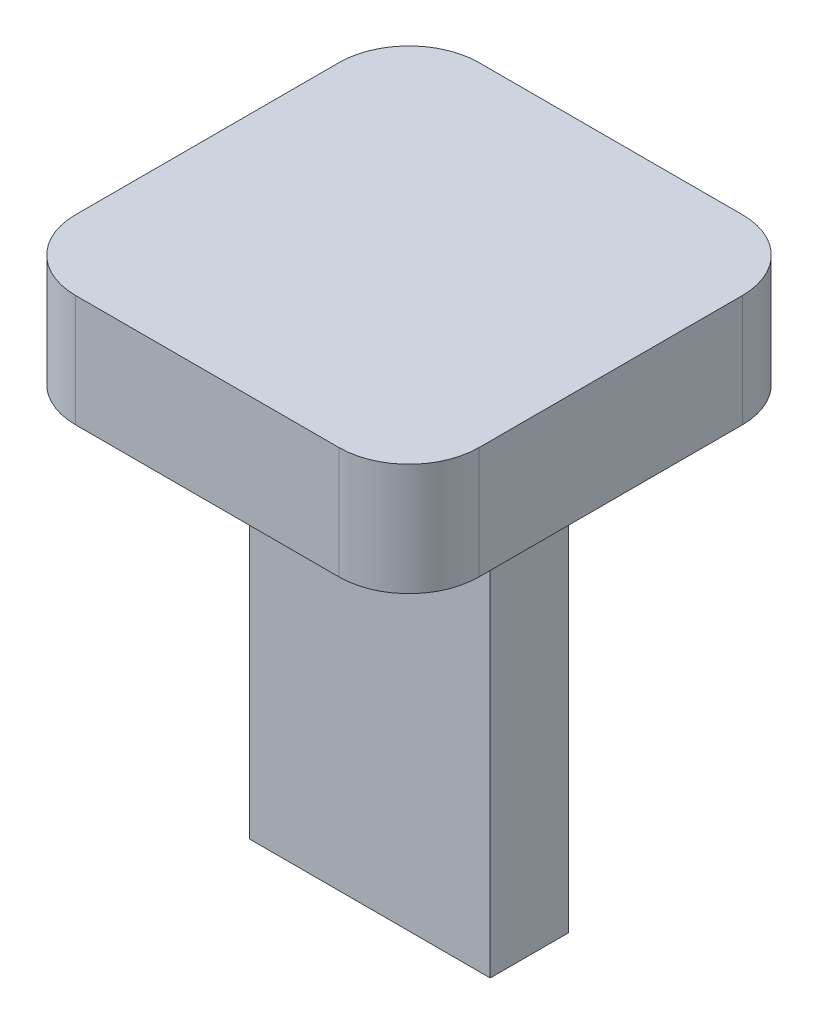
ISO-10303-21;
HEADER;
FILE_DESCRIPTION(('STEP AP214'),'2;1');
FILE_NAME('part.step','',(''),(''),'','','');
FILE_SCHEMA(('AUTOMOTIVE_DESIGN { 1 0 10303 214 1 1 1 1 }'));
ENDSEC;
DATA;
#1=APPLICATION_CONTEXT('core data for automotive mechanical design processes');
#2=APPLICATION_PROTOCOL_DEFINITION('international standard','automotive_design',2000,#1);
#3=PRODUCT_CONTEXT('',#1,'mechanical');
#4=PRODUCT('Part','Part','',(#3));
#5=PRODUCT_RELATED_PRODUCT_CATEGORY('part','',(#4));
#6=PRODUCT_DEFINITION_FORMATION('','',#4);
#7=PRODUCT_DEFINITION_CONTEXT('part definition',#1,'design');
#8=PRODUCT_DEFINITION('design','',#6,#7);
#9=PRODUCT_DEFINITION_SHAPE('','',#8);
#10=(LENGTH_UNIT() NAMED_UNIT(*) SI_UNIT(.MILLI.,.METRE.));
#11=(NAMED_UNIT(*) PLANE_ANGLE_UNIT() SI_UNIT($,.RADIAN.));
#12=(NAMED_UNIT(*) SI_UNIT($,.STERADIAN.) SOLID_ANGLE_UNIT());
#13=UNCERTAINTY_MEASURE_WITH_UNIT(LENGTH_MEASURE(1.E-05),#10,'distance_accuracy_value','');
#14=(GEOMETRIC_REPRESENTATION_CONTEXT(3) GLOBAL_UNCERTAINTY_ASSIGNED_CONTEXT((#13)) GLOBAL_UNIT_ASSIGNED_CONTEXT((#10,
#11,#12)) REPRESENTATION_CONTEXT('',''));
#15=CARTESIAN_POINT('',(0.,0.,0.));
#16=DIRECTION('',(0.,0.,1.));
#17=DIRECTION('',(1.,0.,0.));
#18=AXIS2_PLACEMENT_3D('',#15,#16,#17);
#19=CARTESIAN_POINT('',(2.15,7.75,-0.699999997));
#20=DIRECTION('',(-1.,0.,0.));
#21=DIRECTION('',(0.,0.,1.));
#22=AXIS2_PLACEMENT_3D('',#19,#20,#21);
#23=PLANE('',#22);
#24=DIRECTION('',(0.,-1.,0.));
#25=VECTOR('',#24,1.);
#26=CARTESIAN_POINT('',(2.15,7.75,-0.699999997));
#27=LINE('',#26,#25);
#28=CARTESIAN_POINT('',(2.15,6.5,-0.699999997));
#29=VERTEX_POINT('',#28);
#30=CARTESIAN_POINT('',(2.15,0.,-0.699999997));
#31=VERTEX_POINT('',#30);
#32=EDGE_CURVE('E150',#29,#31,#27,.T.);
#33=ORIENTED_EDGE('',*,*,#32,.F.);
#34=DIRECTION('',(0.,0.,-1.));
#35=VECTOR('',#34,1.);
#36=CARTESIAN_POINT('',(2.15,6.5,0.699999997));
#37=LINE('',#36,#35);
#38=CARTESIAN_POINT('',(2.15,6.5,0.699999997));
#39=VERTEX_POINT('',#38);
#40=EDGE_CURVE('E224',#29,#39,#37,.F.);
#41=ORIENTED_EDGE('',*,*,#40,.T.);
#42=DIRECTION('',(0.,-1.,0.));
#43=VECTOR('',#42,1.);
#44=CARTESIAN_POINT('',(2.15,7.75,0.699999997));
#45=LINE('',#44,#43);
#46=CARTESIAN_POINT('',(2.15,0.,0.699999997));
#47=VERTEX_POINT('',#46);
#48=EDGE_CURVE('E176',#39,#47,#45,.T.);
#49=ORIENTED_EDGE('',*,*,#48,.T.);
#50=DIRECTION('',(0.,0.,-1.));
#51=VECTOR('',#50,1.);
#52=CARTESIAN_POINT('',(2.15,0.,-0.699999997));
#53=LINE('',#52,#51);
#54=EDGE_CURVE('E170',#47,#31,#53,.T.);
#55=ORIENTED_EDGE('',*,*,#54,.T.);
#56=EDGE_LOOP('',(#33,#41,#49,#55));
#57=FACE_BOUND('',#56,.T.);
#58=ADVANCED_FACE('F45',(#57),#23,.F.);
#59=CARTESIAN_POINT('',(-2.15,7.75,-0.699999997));
#60=DIRECTION('',(0.,0.,1.));
#61=DIRECTION('',(1.,0.,0.));
#62=AXIS2_PLACEMENT_3D('',#59,#60,#61);
#63=PLANE('',#62);
#64=DIRECTION('',(0.,-1.,0.));
#65=VECTOR('',#64,1.);
#66=CARTESIAN_POINT('',(-2.15,7.75,-0.699999997));
#67=LINE('',#66,#65);
#68=CARTESIAN_POINT('',(-2.15,6.5,-0.699999997));
#69=VERTEX_POINT('',#68);
#70=CARTESIAN_POINT('',(-2.15,0.,-0.699999997));
#71=VERTEX_POINT('',#70);
#72=EDGE_CURVE('E164',#69,#71,#67,.T.);
#73=ORIENTED_EDGE('',*,*,#72,.F.);
#74=DIRECTION('',(-1.,0.,0.));
#75=VECTOR('',#74,1.);
#76=CARTESIAN_POINT('',(2.15,6.5,-0.699999997));
#77=LINE('',#76,#75);
#78=EDGE_CURVE('E157',#69,#29,#77,.F.);
#79=ORIENTED_EDGE('',*,*,#78,.T.);
#80=ORIENTED_EDGE('',*,*,#32,.T.);
#81=DIRECTION('',(-1.,0.,0.));
#82=VECTOR('',#81,1.);
#83=CARTESIAN_POINT('',(-2.15,0.,-0.699999997));
#84=LINE('',#83,#82);
#85=EDGE_CURVE('E154',#31,#71,#84,.T.);
#86=ORIENTED_EDGE('',*,*,#85,.T.);
#87=EDGE_LOOP('',(#73,#79,#80,#86));
#88=FACE_BOUND('',#87,.T.);
#89=ADVANCED_FACE('F153',(#88),#63,.F.);
#90=CARTESIAN_POINT('',(-2.15,7.75,-0.699999997));
#91=DIRECTION('',(1.,0.,0.));
#92=DIRECTION('',(0.,0.,-1.));
#93=AXIS2_PLACEMENT_3D('',#90,#91,#92);
#94=PLANE('',#93);
#95=DIRECTION('',(0.,-1.,0.));
#96=VECTOR('',#95,1.);
#97=CARTESIAN_POINT('',(-2.15,7.75,0.699999997));
#98=LINE('',#97,#96);
#99=CARTESIAN_POINT('',(-2.15,6.5,0.699999997));
#100=VERTEX_POINT('',#99);
#101=CARTESIAN_POINT('',(-2.15,0.,0.699999997));
#102=VERTEX_POINT('',#101);
#103=EDGE_CURVE('E195',#100,#102,#98,.T.);
#104=ORIENTED_EDGE('',*,*,#103,.F.);
#105=DIRECTION('',(0.,0.,1.));
#106=VECTOR('',#105,1.);
#107=CARTESIAN_POINT('',(-2.15,6.5,-0.699999997));
#108=LINE('',#107,#106);
#109=EDGE_CURVE('E229',#100,#69,#108,.F.);
#110=ORIENTED_EDGE('',*,*,#109,.T.);
#111=ORIENTED_EDGE('',*,*,#72,.T.);
#112=DIRECTION('',(0.,0.,1.));
#113=VECTOR('',#112,1.);
#114=CARTESIAN_POINT('',(-2.15,0.,-0.699999997));
#115=LINE('',#114,#113);
#116=EDGE_CURVE('E172',#71,#102,#115,.T.);
#117=ORIENTED_EDGE('',*,*,#116,.T.);
#118=EDGE_LOOP('',(#104,#110,#111,#117));
#119=FACE_BOUND('',#118,.T.);
#120=ADVANCED_FACE('F356',(#119),#94,.F.);
#121=CARTESIAN_POINT('',(-2.15,7.75,0.699999997));
#122=DIRECTION('',(0.,0.,-1.));
#123=DIRECTION('',(-1.,0.,0.));
#124=AXIS2_PLACEMENT_3D('',#121,#122,#123);
#125=PLANE('',#124);
#126=ORIENTED_EDGE('',*,*,#48,.F.);
#127=DIRECTION('',(1.,0.,0.));
#128=VECTOR('',#127,1.);
#129=CARTESIAN_POINT('',(-2.15,6.5,0.699999997));
#130=LINE('',#129,#128);
#131=EDGE_CURVE('E232',#39,#100,#130,.F.);
#132=ORIENTED_EDGE('',*,*,#131,.T.);
#133=ORIENTED_EDGE('',*,*,#103,.T.);
#134=DIRECTION('',(1.,0.,0.));
#135=VECTOR('',#134,1.);
#136=CARTESIAN_POINT('',(-2.15,0.,0.699999997));
#137=LINE('',#136,#135);
#138=EDGE_CURVE('E190',#102,#47,#137,.T.);
#139=ORIENTED_EDGE('',*,*,#138,.T.);
#140=EDGE_LOOP('',(#126,#132,#133,#139));
#141=FACE_BOUND('',#140,.T.);
#142=ADVANCED_FACE('F474',(#141),#125,.F.);
#143=CARTESIAN_POINT('',(0.,0.,0.));
#144=DIRECTION('',(0.,1.,0.));
#145=DIRECTION('',(0.,0.,1.));
#146=AXIS2_PLACEMENT_3D('',#143,#144,#145);
#147=PLANE('',#146);
#148=ORIENTED_EDGE('',*,*,#54,.F.);
#149=ORIENTED_EDGE('',*,*,#138,.F.);
#150=ORIENTED_EDGE('',*,*,#116,.F.);
#151=ORIENTED_EDGE('',*,*,#85,.F.);
#152=EDGE_LOOP('',(#148,#149,#150,#151));
#153=FACE_BOUND('',#152,.T.);
#154=ADVANCED_FACE('F168',(#153),#147,.F.);
#155=CARTESIAN_POINT('',(0.,7.75,0.));
#156=DIRECTION('',(0.,1.,0.));
#157=DIRECTION('',(0.,0.,1.));
#158=AXIS2_PLACEMENT_3D('',#155,#156,#157);
#159=PLANE('',#158);
#160=DIRECTION('',(1.,0.,0.));
#161=VECTOR('',#160,1.);
#162=CARTESIAN_POINT('',(2.15,7.75,1.949999997));
#163=LINE('',#162,#161);
#164=CARTESIAN_POINT('',(-3.4,7.75,1.949999997));
#165=VERTEX_POINT('',#164);
#166=CARTESIAN_POINT('',(3.4,7.75,1.949999997));
#167=VERTEX_POINT('',#166);
#168=EDGE_CURVE('E211',#165,#167,#163,.T.);
#169=ORIENTED_EDGE('',*,*,#168,.T.);
#170=DIRECTION('',(0.,0.,-1.));
#171=VECTOR('',#170,1.);
#172=CARTESIAN_POINT('',(3.4,7.75,-0.699999997));
#173=LINE('',#172,#171);
#174=CARTESIAN_POINT('',(3.4,7.75,-1.949999997));
#175=VERTEX_POINT('',#174);
#176=EDGE_CURVE('E220',#167,#175,#173,.T.);
#177=ORIENTED_EDGE('',*,*,#176,.T.);
#178=DIRECTION('',(-1.,0.,0.));
#179=VECTOR('',#178,1.);
#180=CARTESIAN_POINT('',(-2.15,7.75,-1.949999997));
#181=LINE('',#180,#179);
#182=CARTESIAN_POINT('',(-3.4,7.75,-1.949999997));
#183=VERTEX_POINT('',#182);
#184=EDGE_CURVE('E217',#175,#183,#181,.T.);
#185=ORIENTED_EDGE('',*,*,#184,.T.);
#186=DIRECTION('',(0.,0.,1.));
#187=VECTOR('',#186,1.);
#188=CARTESIAN_POINT('',(-3.4,7.75,0.699999997));
#189=LINE('',#188,#187);
#190=EDGE_CURVE('E214',#183,#165,#189,.T.);
#191=ORIENTED_EDGE('',*,*,#190,.T.);
#192=EDGE_LOOP('',(#169,#177,#185,#191));
#193=FACE_BOUND('',#192,.T.);
#194=DIRECTION('',(-1.,0.,0.));
#195=VECTOR('',#194,1.);
#196=CARTESIAN_POINT('',(-3.6,7.75,-3.6));
#197=LINE('',#196,#195);
#198=CARTESIAN_POINT('',(2.35,7.75,-3.6));
#199=VERTEX_POINT('',#198);
#200=CARTESIAN_POINT('',(-2.35,7.75,-3.6));
#201=VERTEX_POINT('',#200);
#202=EDGE_CURVE('E289',#199,#201,#197,.T.);
#203=ORIENTED_EDGE('',*,*,#202,.F.);
#204=CARTESIAN_POINT('',(2.35,7.75,-2.35));
#205=DIRECTION('',(0.,1.,0.));
#206=DIRECTION('',(0.,0.,1.));
#207=AXIS2_PLACEMENT_3D('',#204,#205,#206);
#208=CIRCLE('',#207,1.25);
#209=CARTESIAN_POINT('',(3.6,7.75,-2.35));
#210=VERTEX_POINT('',#209);
#211=EDGE_CURVE('E208',#199,#210,#208,.F.);
#212=ORIENTED_EDGE('',*,*,#211,.T.);
#213=DIRECTION('',(0.,0.,-1.));
#214=VECTOR('',#213,1.);
#215=CARTESIAN_POINT('',(3.6,7.75,-3.6));
#216=LINE('',#215,#214);
#217=CARTESIAN_POINT('',(3.6,7.75,2.35));
#218=VERTEX_POINT('',#217);
#219=EDGE_CURVE('E282',#218,#210,#216,.T.);
#220=ORIENTED_EDGE('',*,*,#219,.F.);
#221=CARTESIAN_POINT('',(2.35,7.75,2.35));
#222=DIRECTION('',(0.,1.,0.));
#223=DIRECTION('',(0.,0.,1.));
#224=AXIS2_PLACEMENT_3D('',#221,#222,#223);
#225=CIRCLE('',#224,1.25);
#226=CARTESIAN_POINT('',(2.35,7.75,3.6));
#227=VERTEX_POINT('',#226);
#228=EDGE_CURVE('E205',#218,#227,#225,.F.);
#229=ORIENTED_EDGE('',*,*,#228,.T.);
#230=DIRECTION('',(1.,0.,0.));
#231=VECTOR('',#230,1.);
#232=CARTESIAN_POINT('',(-3.6,7.75,3.6));
#233=LINE('',#232,#231);
#234=CARTESIAN_POINT('',(-2.35,7.75,3.6));
#235=VERTEX_POINT('',#234);
#236=EDGE_CURVE('E185',#235,#227,#233,.T.);
#237=ORIENTED_EDGE('',*,*,#236,.F.);
#238=CARTESIAN_POINT('',(-2.35,7.75,2.35));
#239=DIRECTION('',(0.,1.,0.));
#240=DIRECTION('',(0.,0.,1.));
#241=AXIS2_PLACEMENT_3D('',#238,#239,#240);
#242=CIRCLE('',#241,1.25);
#243=CARTESIAN_POINT('',(-3.6,7.75,2.35));
#244=VERTEX_POINT('',#243);
#245=EDGE_CURVE('E202',#235,#244,#242,.F.);
#246=ORIENTED_EDGE('',*,*,#245,.T.);
#247=DIRECTION('',(0.,0.,1.));
#248=VECTOR('',#247,1.);
#249=CARTESIAN_POINT('',(-3.6,7.75,-3.6));
#250=LINE('',#249,#248);
#251=CARTESIAN_POINT('',(-3.6,7.75,-2.35));
#252=VERTEX_POINT('',#251);
#253=EDGE_CURVE('E296',#252,#244,#250,.T.);
#254=ORIENTED_EDGE('',*,*,#253,.F.);
#255=CARTESIAN_POINT('',(-2.35,7.75,-2.35));
#256=DIRECTION('',(0.,1.,0.));
#257=DIRECTION('',(0.,0.,1.));
#258=AXIS2_PLACEMENT_3D('',#255,#256,#257);
#259=CIRCLE('',#258,1.25);
#260=EDGE_CURVE('E163',#252,#201,#259,.F.);
#261=ORIENTED_EDGE('',*,*,#260,.T.);
#262=EDGE_LOOP('',(#203,#212,#220,#229,#237,#246,#254,#261));
#263=FACE_BOUND('',#262,.T.);
#264=ADVANCED_FACE('F327',(#193,#263),#159,.F.);
#265=CARTESIAN_POINT('',(3.6,9.75,-3.6));
#266=DIRECTION('',(-1.,0.,0.));
#267=DIRECTION('',(0.,0.,1.));
#268=AXIS2_PLACEMENT_3D('',#265,#266,#267);
#269=PLANE('',#268);
#270=ORIENTED_EDGE('',*,*,#219,.T.);
#271=DIRECTION('',(0.,-1.,0.));
#272=VECTOR('',#271,1.);
#273=CARTESIAN_POINT('',(3.6,9.75,-2.35));
#274=LINE('',#273,#272);
#275=CARTESIAN_POINT('',(3.6,9.75,-2.35));
#276=VERTEX_POINT('',#275);
#277=EDGE_CURVE('E246',#210,#276,#274,.F.);
#278=ORIENTED_EDGE('',*,*,#277,.T.);
#279=DIRECTION('',(0.,0.,-1.));
#280=VECTOR('',#279,1.);
#281=CARTESIAN_POINT('',(3.6,9.75,-3.6));
#282=LINE('',#281,#280);
#283=CARTESIAN_POINT('',(3.6,9.75,2.35));
#284=VERTEX_POINT('',#283);
#285=EDGE_CURVE('E305',#284,#276,#282,.T.);
#286=ORIENTED_EDGE('',*,*,#285,.F.);
#287=DIRECTION('',(0.,-1.,0.));
#288=VECTOR('',#287,1.);
#289=CARTESIAN_POINT('',(3.6,9.75,2.35));
#290=LINE('',#289,#288);
#291=EDGE_CURVE('E242',#284,#218,#290,.T.);
#292=ORIENTED_EDGE('',*,*,#291,.T.);
#293=EDGE_LOOP('',(#270,#278,#286,#292));
#294=FACE_BOUND('',#293,.T.);
#295=ADVANCED_FACE('F332',(#294),#269,.F.);
#296=CARTESIAN_POINT('',(-3.6,9.75,-3.6));
#297=DIRECTION('',(0.,0.,1.));
#298=DIRECTION('',(1.,0.,0.));
#299=AXIS2_PLACEMENT_3D('',#296,#297,#298);
#300=PLANE('',#299);
#301=DIRECTION('',(-1.,0.,0.));
#302=VECTOR('',#301,1.);
#303=CARTESIAN_POINT('',(-3.6,9.75,-3.6));
#304=LINE('',#303,#302);
#305=CARTESIAN_POINT('',(2.35,9.75,-3.6));
#306=VERTEX_POINT('',#305);
#307=CARTESIAN_POINT('',(-2.35,9.75,-3.6));
#308=VERTEX_POINT('',#307);
#309=EDGE_CURVE('E309',#306,#308,#304,.T.);
#310=ORIENTED_EDGE('',*,*,#309,.F.);
#311=DIRECTION('',(0.,-1.,0.));
#312=VECTOR('',#311,1.);
#313=CARTESIAN_POINT('',(2.35,9.75,-3.6));
#314=LINE('',#313,#312);
#315=EDGE_CURVE('E238',#306,#199,#314,.T.);
#316=ORIENTED_EDGE('',*,*,#315,.T.);
#317=ORIENTED_EDGE('',*,*,#202,.T.);
#318=DIRECTION('',(0.,-1.,0.));
#319=VECTOR('',#318,1.);
#320=CARTESIAN_POINT('',(-2.35,9.75,-3.6));
#321=LINE('',#320,#319);
#322=EDGE_CURVE('E235',#201,#308,#321,.F.);
#323=ORIENTED_EDGE('',*,*,#322,.T.);
#324=EDGE_LOOP('',(#310,#316,#317,#323));
#325=FACE_BOUND('',#324,.T.);
#326=ADVANCED_FACE('F338',(#325),#300,.F.);
#327=CARTESIAN_POINT('',(-3.6,9.75,-3.6));
#328=DIRECTION('',(1.,0.,0.));
#329=DIRECTION('',(0.,0.,-1.));
#330=AXIS2_PLACEMENT_3D('',#327,#328,#329);
#331=PLANE('',#330);
#332=ORIENTED_EDGE('',*,*,#253,.T.);
#333=DIRECTION('',(0.,-1.,0.));
#334=VECTOR('',#333,1.);
#335=CARTESIAN_POINT('',(-3.6,9.75,2.35));
#336=LINE('',#335,#334);
#337=CARTESIAN_POINT('',(-3.6,9.75,2.35));
#338=VERTEX_POINT('',#337);
#339=EDGE_CURVE('E11',#244,#338,#336,.F.);
#340=ORIENTED_EDGE('',*,*,#339,.T.);
#341=DIRECTION('',(0.,0.,1.));
#342=VECTOR('',#341,1.);
#343=CARTESIAN_POINT('',(-3.6,9.75,-3.6));
#344=LINE('',#343,#342);
#345=CARTESIAN_POINT('',(-3.6,9.75,-2.35));
#346=VERTEX_POINT('',#345);
#347=EDGE_CURVE('E182',#346,#338,#344,.T.);
#348=ORIENTED_EDGE('',*,*,#347,.F.);
#349=DIRECTION('',(0.,-1.,0.));
#350=VECTOR('',#349,1.);
#351=CARTESIAN_POINT('',(-3.6,9.75,-2.35));
#352=LINE('',#351,#350);
#353=EDGE_CURVE('E55',#346,#252,#352,.T.);
#354=ORIENTED_EDGE('',*,*,#353,.T.);
#355=EDGE_LOOP('',(#332,#340,#348,#354));
#356=FACE_BOUND('',#355,.T.);
#357=ADVANCED_FACE('F341',(#356),#331,.F.);
#358=CARTESIAN_POINT('',(-3.6,9.75,3.6));
#359=DIRECTION('',(0.,0.,-1.));
#360=DIRECTION('',(-1.,0.,0.));
#361=AXIS2_PLACEMENT_3D('',#358,#359,#360);
#362=PLANE('',#361);
#363=ORIENTED_EDGE('',*,*,#236,.T.);
#364=DIRECTION('',(0.,-1.,0.));
#365=VECTOR('',#364,1.);
#366=CARTESIAN_POINT('',(2.35,9.75,3.6));
#367=LINE('',#366,#365);
#368=CARTESIAN_POINT('',(2.35,9.75,3.6));
#369=VERTEX_POINT('',#368);
#370=EDGE_CURVE('E63',#227,#369,#367,.F.);
#371=ORIENTED_EDGE('',*,*,#370,.T.);
#372=DIRECTION('',(1.,0.,0.));
#373=VECTOR('',#372,1.);
#374=CARTESIAN_POINT('',(-3.6,9.75,3.6));
#375=LINE('',#374,#373);
#376=CARTESIAN_POINT('',(-2.35,9.75,3.6));
#377=VERTEX_POINT('',#376);
#378=EDGE_CURVE('E179',#377,#369,#375,.T.);
#379=ORIENTED_EDGE('',*,*,#378,.F.);
#380=DIRECTION('',(0.,-1.,0.));
#381=VECTOR('',#380,1.);
#382=CARTESIAN_POINT('',(-2.35,9.75,3.6));
#383=LINE('',#382,#381);
#384=EDGE_CURVE('E260',#377,#235,#383,.T.);
#385=ORIENTED_EDGE('',*,*,#384,.T.);
#386=EDGE_LOOP('',(#363,#371,#379,#385));
#387=FACE_BOUND('',#386,.T.);
#388=ADVANCED_FACE('F324',(#387),#362,.F.);
#389=CARTESIAN_POINT('',(0.,9.75,0.));
#390=DIRECTION('',(0.,1.,0.));
#391=DIRECTION('',(0.,0.,1.));
#392=AXIS2_PLACEMENT_3D('',#389,#390,#391);
#393=PLANE('',#392);
#394=ORIENTED_EDGE('',*,*,#285,.T.);
#395=CARTESIAN_POINT('',(2.35,9.75,-2.35));
#396=DIRECTION('',(0.,1.,0.));
#397=DIRECTION('',(0.,0.,1.));
#398=AXIS2_PLACEMENT_3D('',#395,#396,#397);
#399=CIRCLE('',#398,1.25);
#400=EDGE_CURVE('E257',#276,#306,#399,.T.);
#401=ORIENTED_EDGE('',*,*,#400,.T.);
#402=ORIENTED_EDGE('',*,*,#309,.T.);
#403=CARTESIAN_POINT('',(-2.35,9.75,-2.35));
#404=DIRECTION('',(0.,1.,0.));
#405=DIRECTION('',(0.,0.,1.));
#406=AXIS2_PLACEMENT_3D('',#403,#404,#405);
#407=CIRCLE('',#406,1.25);
#408=EDGE_CURVE('E249',#308,#346,#407,.T.);
#409=ORIENTED_EDGE('',*,*,#408,.T.);
#410=ORIENTED_EDGE('',*,*,#347,.T.);
#411=CARTESIAN_POINT('',(-2.35,9.75,2.35));
#412=DIRECTION('',(0.,1.,0.));
#413=DIRECTION('',(0.,0.,1.));
#414=AXIS2_PLACEMENT_3D('',#411,#412,#413);
#415=CIRCLE('',#414,1.25);
#416=EDGE_CURVE('E70',#338,#377,#415,.T.);
#417=ORIENTED_EDGE('',*,*,#416,.T.);
#418=ORIENTED_EDGE('',*,*,#378,.T.);
#419=CARTESIAN_POINT('',(2.35,9.75,2.35));
#420=DIRECTION('',(0.,1.,0.));
#421=DIRECTION('',(0.,0.,1.));
#422=AXIS2_PLACEMENT_3D('',#419,#420,#421);
#423=CIRCLE('',#422,1.25);
#424=EDGE_CURVE('E254',#369,#284,#423,.T.);
#425=ORIENTED_EDGE('',*,*,#424,.T.);
#426=EDGE_LOOP('',(#394,#401,#402,#409,#410,#417,#418,#425));
#427=FACE_BOUND('',#426,.T.);
#428=ADVANCED_FACE('F318',(#427),#393,.T.);
#429=CARTESIAN_POINT('',(-3.4,6.5,0.));
#430=DIRECTION('',(0.,0.,-1.));
#431=DIRECTION('',(-1.,0.,0.));
#432=AXIS2_PLACEMENT_3D('',#429,#430,#431);
#433=CYLINDRICAL_SURFACE('',#432,1.25);
#434=CARTESIAN_POINT('',(-3.4,6.5,-1.949999997));
#435=DIRECTION('',(0.707106781186547,0.,-0.707106781186547));
#436=DIRECTION('',(-0.707106781186547,0.,-0.707106781186547));
#437=AXIS2_PLACEMENT_3D('',#434,#435,#436);
#438=ELLIPSE('',#437,1.76776695296637,1.25);
#439=EDGE_CURVE('E274',#69,#183,#438,.F.);
#440=ORIENTED_EDGE('',*,*,#439,.F.);
#441=ORIENTED_EDGE('',*,*,#109,.F.);
#442=CARTESIAN_POINT('',(-3.4,6.5,1.949999997));
#443=DIRECTION('',(-0.707106781186547,0.,-0.707106781186547));
#444=DIRECTION('',(-0.707106781186547,0.,0.707106781186547));
#445=AXIS2_PLACEMENT_3D('',#442,#443,#444);
#446=ELLIPSE('',#445,1.76776695296637,1.25);
#447=EDGE_CURVE('E49',#165,#100,#446,.T.);
#448=ORIENTED_EDGE('',*,*,#447,.F.);
#449=ORIENTED_EDGE('',*,*,#190,.F.);
#450=EDGE_LOOP('',(#440,#441,#448,#449));
#451=FACE_BOUND('',#450,.T.);
#452=ADVANCED_FACE('F370',(#451),#433,.F.);
#453=CARTESIAN_POINT('',(0.,6.5,1.949999997));
#454=DIRECTION('',(-1.,0.,0.));
#455=DIRECTION('',(0.,0.,1.));
#456=AXIS2_PLACEMENT_3D('',#453,#454,#455);
#457=CYLINDRICAL_SURFACE('',#456,1.25);
#458=ORIENTED_EDGE('',*,*,#447,.T.);
#459=ORIENTED_EDGE('',*,*,#131,.F.);
#460=CARTESIAN_POINT('',(3.4,6.5,1.949999997));
#461=DIRECTION('',(-0.707106781186547,0.,0.707106781186547));
#462=DIRECTION('',(-0.707106781186547,0.,-0.707106781186547));
#463=AXIS2_PLACEMENT_3D('',#460,#461,#462);
#464=ELLIPSE('',#463,1.76776695296637,1.25);
#465=EDGE_CURVE('E272',#167,#39,#464,.T.);
#466=ORIENTED_EDGE('',*,*,#465,.F.);
#467=ORIENTED_EDGE('',*,*,#168,.F.);
#468=EDGE_LOOP('',(#458,#459,#466,#467));
#469=FACE_BOUND('',#468,.T.);
#470=ADVANCED_FACE('F367',(#469),#457,.F.);
#471=CARTESIAN_POINT('',(0.,6.5,-1.949999997));
#472=DIRECTION('',(1.,0.,0.));
#473=DIRECTION('',(0.,0.,-1.));
#474=AXIS2_PLACEMENT_3D('',#471,#472,#473);
#475=CYLINDRICAL_SURFACE('',#474,1.25);
#476=ORIENTED_EDGE('',*,*,#439,.T.);
#477=ORIENTED_EDGE('',*,*,#184,.F.);
#478=CARTESIAN_POINT('',(3.4,6.5,-1.949999997));
#479=DIRECTION('',(0.707106781186547,0.,0.707106781186547));
#480=DIRECTION('',(0.707106781186547,0.,-0.707106781186547));
#481=AXIS2_PLACEMENT_3D('',#478,#479,#480);
#482=ELLIPSE('',#481,1.76776695296637,1.25);
#483=EDGE_CURVE('E269',#29,#175,#482,.F.);
#484=ORIENTED_EDGE('',*,*,#483,.F.);
#485=ORIENTED_EDGE('',*,*,#78,.F.);
#486=EDGE_LOOP('',(#476,#477,#484,#485));
#487=FACE_BOUND('',#486,.T.);
#488=ADVANCED_FACE('F363',(#487),#475,.F.);
#489=CARTESIAN_POINT('',(3.4,6.5,0.));
#490=DIRECTION('',(0.,0.,1.));
#491=DIRECTION('',(1.,0.,0.));
#492=AXIS2_PLACEMENT_3D('',#489,#490,#491);
#493=CYLINDRICAL_SURFACE('',#492,1.25);
#494=ORIENTED_EDGE('',*,*,#465,.T.);
#495=ORIENTED_EDGE('',*,*,#40,.F.);
#496=ORIENTED_EDGE('',*,*,#483,.T.);
#497=ORIENTED_EDGE('',*,*,#176,.F.);
#498=EDGE_LOOP('',(#494,#495,#496,#497));
#499=FACE_BOUND('',#498,.T.);
#500=ADVANCED_FACE('F360',(#499),#493,.F.);
#501=CARTESIAN_POINT('',(2.35,9.75,-2.35));
#502=DIRECTION('',(0.,-1.,0.));
#503=DIRECTION('',(0.,0.,-1.));
#504=AXIS2_PLACEMENT_3D('',#501,#502,#503);
#505=CYLINDRICAL_SURFACE('',#504,1.25);
#506=ORIENTED_EDGE('',*,*,#400,.F.);
#507=ORIENTED_EDGE('',*,*,#277,.F.);
#508=ORIENTED_EDGE('',*,*,#211,.F.);
#509=ORIENTED_EDGE('',*,*,#315,.F.);
#510=EDGE_LOOP('',(#506,#507,#508,#509));
#511=FACE_BOUND('',#510,.T.);
#512=ADVANCED_FACE('F334',(#511),#505,.T.);
#513=CARTESIAN_POINT('',(2.35,9.75,2.35));
#514=DIRECTION('',(0.,-1.,0.));
#515=DIRECTION('',(0.,0.,-1.));
#516=AXIS2_PLACEMENT_3D('',#513,#514,#515);
#517=CYLINDRICAL_SURFACE('',#516,1.25);
#518=ORIENTED_EDGE('',*,*,#424,.F.);
#519=ORIENTED_EDGE('',*,*,#370,.F.);
#520=ORIENTED_EDGE('',*,*,#228,.F.);
#521=ORIENTED_EDGE('',*,*,#291,.F.);
#522=EDGE_LOOP('',(#518,#519,#520,#521));
#523=FACE_BOUND('',#522,.T.);
#524=ADVANCED_FACE('F331',(#523),#517,.T.);
#525=CARTESIAN_POINT('',(-2.35,9.75,2.35));
#526=DIRECTION('',(0.,-1.,0.));
#527=DIRECTION('',(0.,0.,-1.));
#528=AXIS2_PLACEMENT_3D('',#525,#526,#527);
#529=CYLINDRICAL_SURFACE('',#528,1.25);
#530=ORIENTED_EDGE('',*,*,#416,.F.);
#531=ORIENTED_EDGE('',*,*,#339,.F.);
#532=ORIENTED_EDGE('',*,*,#245,.F.);
#533=ORIENTED_EDGE('',*,*,#384,.F.);
#534=EDGE_LOOP('',(#530,#531,#532,#533));
#535=FACE_BOUND('',#534,.T.);
#536=ADVANCED_FACE('F323',(#535),#529,.T.);
#537=CARTESIAN_POINT('',(-2.35,9.75,-2.35));
#538=DIRECTION('',(0.,-1.,0.));
#539=DIRECTION('',(0.,0.,-1.));
#540=AXIS2_PLACEMENT_3D('',#537,#538,#539);
#541=CYLINDRICAL_SURFACE('',#540,1.25);
#542=ORIENTED_EDGE('',*,*,#408,.F.);
#543=ORIENTED_EDGE('',*,*,#322,.F.);
#544=ORIENTED_EDGE('',*,*,#260,.F.);
#545=ORIENTED_EDGE('',*,*,#353,.F.);
#546=EDGE_LOOP('',(#542,#543,#544,#545));
#547=FACE_BOUND('',#546,.T.);
#548=ADVANCED_FACE('F47',(#547),#541,.T.);
#549=CLOSED_SHELL('',(#58,#89,#120,#142,#154,#264,#295,#326,#357,#388,#428,#452,#470,#488,#500,
#512,#524,#536,#548));
#550=MANIFOLD_SOLID_BREP('B2',#549);
#551=ADVANCED_BREP_SHAPE_REPRESENTATION('',(#18,#550),#14);
#552=SHAPE_DEFINITION_REPRESENTATION(#9,#551);
ENDSEC;
END-ISO-10303-21;
